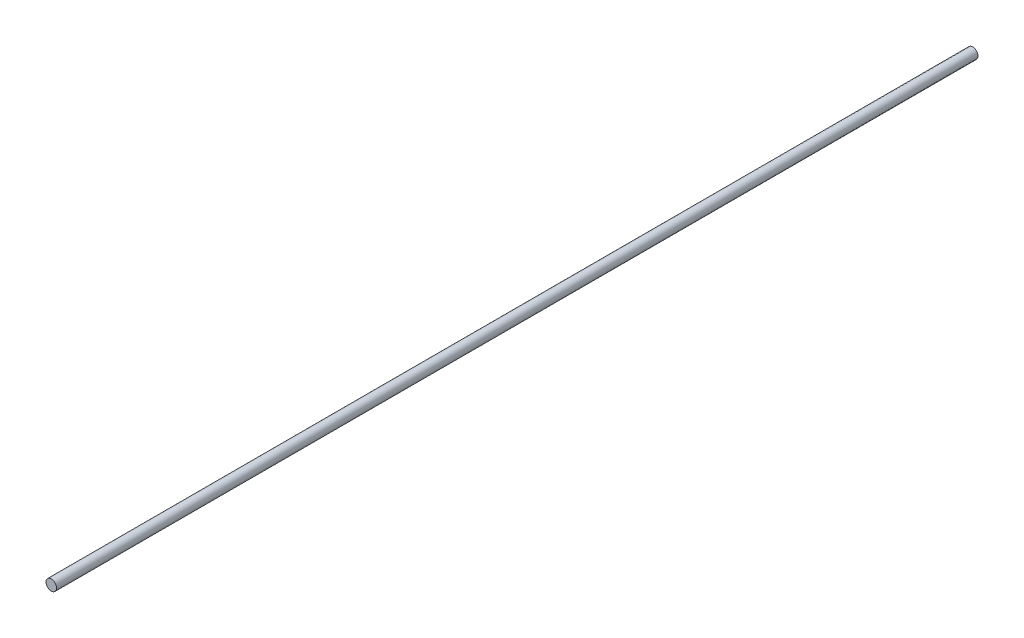
ISO-10303-21;
HEADER;
FILE_DESCRIPTION(('STEP AP214'),'2;1');
FILE_NAME('part.step','',(''),(''),'','','');
FILE_SCHEMA(('AUTOMOTIVE_DESIGN { 1 0 10303 214 1 1 1 1 }'));
ENDSEC;
DATA;
#1=APPLICATION_CONTEXT('core data for automotive mechanical design processes');
#2=APPLICATION_PROTOCOL_DEFINITION('international standard','automotive_design',2000,#1);
#3=PRODUCT_CONTEXT('',#1,'mechanical');
#4=PRODUCT('Part','Part','',(#3));
#5=PRODUCT_RELATED_PRODUCT_CATEGORY('part','',(#4));
#6=PRODUCT_DEFINITION_FORMATION('','',#4);
#7=PRODUCT_DEFINITION_CONTEXT('part definition',#1,'design');
#8=PRODUCT_DEFINITION('design','',#6,#7);
#9=PRODUCT_DEFINITION_SHAPE('','',#8);
#10=(LENGTH_UNIT() NAMED_UNIT(*) SI_UNIT(.MILLI.,.METRE.));
#11=(NAMED_UNIT(*) PLANE_ANGLE_UNIT() SI_UNIT($,.RADIAN.));
#12=(NAMED_UNIT(*) SI_UNIT($,.STERADIAN.) SOLID_ANGLE_UNIT());
#13=UNCERTAINTY_MEASURE_WITH_UNIT(LENGTH_MEASURE(1.E-05),#10,'distance_accuracy_value','');
#14=(GEOMETRIC_REPRESENTATION_CONTEXT(3) GLOBAL_UNCERTAINTY_ASSIGNED_CONTEXT((#13)) GLOBAL_UNIT_ASSIGNED_CONTEXT((#10,
#11,#12)) REPRESENTATION_CONTEXT('',''));
#15=CARTESIAN_POINT('',(0.,0.,0.));
#16=DIRECTION('',(0.,0.,1.));
#17=DIRECTION('',(1.,0.,0.));
#18=AXIS2_PLACEMENT_3D('',#15,#16,#17);
#19=CARTESIAN_POINT('',(0.,0.,700.));
#20=DIRECTION('',(0.,0.,-1.));
#21=DIRECTION('',(-1.,0.,0.));
#22=AXIS2_PLACEMENT_3D('',#19,#20,#21);
#23=CYLINDRICAL_SURFACE('',#22,4.);
#24=CARTESIAN_POINT('',(0.,0.,700.));
#25=DIRECTION('',(0.,0.,1.));
#26=DIRECTION('',(1.,0.,0.));
#27=AXIS2_PLACEMENT_3D('',#24,#25,#26);
#28=CIRCLE('',#27,4.);
#29=CARTESIAN_POINT('',(4.,0.,700.));
#30=VERTEX_POINT('',#29);
#31=EDGE_CURVE('E10',#30,#30,#28,.T.);
#32=ORIENTED_EDGE('',*,*,#31,.F.);
#33=EDGE_LOOP('',(#32));
#34=FACE_BOUND('',#33,.T.);
#35=CARTESIAN_POINT('',(0.,0.,0.));
#36=DIRECTION('',(0.,0.,1.));
#37=DIRECTION('',(1.,0.,0.));
#38=AXIS2_PLACEMENT_3D('',#35,#36,#37);
#39=CIRCLE('',#38,4.);
#40=CARTESIAN_POINT('',(4.,0.,0.));
#41=VERTEX_POINT('',#40);
#42=EDGE_CURVE('E34',#41,#41,#39,.T.);
#43=ORIENTED_EDGE('',*,*,#42,.T.);
#44=EDGE_LOOP('',(#43));
#45=FACE_BOUND('',#44,.T.);
#46=ADVANCED_FACE('F31',(#34,#45),#23,.T.);
#47=CARTESIAN_POINT('',(0.,0.,700.));
#48=DIRECTION('',(0.,0.,1.));
#49=DIRECTION('',(1.,0.,0.));
#50=AXIS2_PLACEMENT_3D('',#47,#48,#49);
#51=PLANE('',#50);
#52=ORIENTED_EDGE('',*,*,#31,.T.);
#53=EDGE_LOOP('',(#52));
#54=FACE_BOUND('',#53,.T.);
#55=ADVANCED_FACE('F46',(#54),#51,.T.);
#56=CARTESIAN_POINT('',(0.,0.,0.));
#57=DIRECTION('',(0.,0.,1.));
#58=DIRECTION('',(1.,0.,0.));
#59=AXIS2_PLACEMENT_3D('',#56,#57,#58);
#60=PLANE('',#59);
#61=ORIENTED_EDGE('',*,*,#42,.F.);
#62=EDGE_LOOP('',(#61));
#63=FACE_BOUND('',#62,.T.);
#64=ADVANCED_FACE('F44',(#63),#60,.F.);
#65=CLOSED_SHELL('',(#46,#55,#64));
#66=MANIFOLD_SOLID_BREP('B2',#65);
#67=ADVANCED_BREP_SHAPE_REPRESENTATION('',(#18,#66),#14);
#68=SHAPE_DEFINITION_REPRESENTATION(#9,#67);
ENDSEC;
END-ISO-10303-21;
